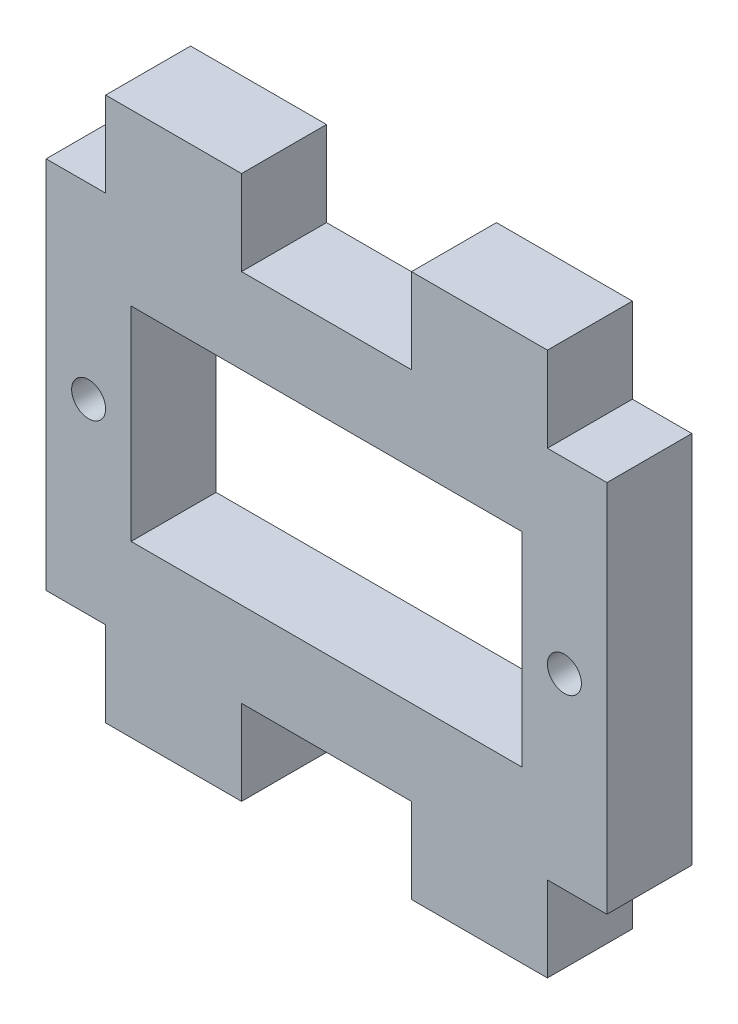
ISO-10303-21;
HEADER;
FILE_DESCRIPTION(('STEP AP214'),'2;1');
FILE_NAME('part.step','',(''),(''),'','','');
FILE_SCHEMA(('AUTOMOTIVE_DESIGN { 1 0 10303 214 1 1 1 1 }'));
ENDSEC;
DATA;
#1=APPLICATION_CONTEXT('core data for automotive mechanical design processes');
#2=APPLICATION_PROTOCOL_DEFINITION('international standard','automotive_design',2000,#1);
#3=PRODUCT_CONTEXT('',#1,'mechanical');
#4=PRODUCT('Part','Part','',(#3));
#5=PRODUCT_RELATED_PRODUCT_CATEGORY('part','',(#4));
#6=PRODUCT_DEFINITION_FORMATION('','',#4);
#7=PRODUCT_DEFINITION_CONTEXT('part definition',#1,'design');
#8=PRODUCT_DEFINITION('design','',#6,#7);
#9=PRODUCT_DEFINITION_SHAPE('','',#8);
#10=(LENGTH_UNIT() NAMED_UNIT(*) SI_UNIT(.MILLI.,.METRE.));
#11=(NAMED_UNIT(*) PLANE_ANGLE_UNIT() SI_UNIT($,.RADIAN.));
#12=(NAMED_UNIT(*) SI_UNIT($,.STERADIAN.) SOLID_ANGLE_UNIT());
#13=UNCERTAINTY_MEASURE_WITH_UNIT(LENGTH_MEASURE(1.E-05),#10,'distance_accuracy_value','');
#14=(GEOMETRIC_REPRESENTATION_CONTEXT(3) GLOBAL_UNCERTAINTY_ASSIGNED_CONTEXT((#13)) GLOBAL_UNIT_ASSIGNED_CONTEXT((#10,
#11,#12)) REPRESENTATION_CONTEXT('',''));
#15=CARTESIAN_POINT('',(0.,0.,0.));
#16=DIRECTION('',(0.,0.,1.));
#17=DIRECTION('',(1.,0.,0.));
#18=AXIS2_PLACEMENT_3D('',#15,#16,#17);
#19=CARTESIAN_POINT('',(0.,0.,5.));
#20=DIRECTION('',(0.,0.,-1.));
#21=DIRECTION('',(-1.,0.,0.));
#22=AXIS2_PLACEMENT_3D('',#19,#20,#21);
#23=PLANE('',#22);
#24=CARTESIAN_POINT('',(14.,0.,5.));
#25=DIRECTION('',(0.,0.,1.));
#26=DIRECTION('',(1.,0.,0.));
#27=AXIS2_PLACEMENT_3D('',#24,#25,#26);
#28=CIRCLE('',#27,1.);
#29=CARTESIAN_POINT('',(15.,0.,5.));
#30=VERTEX_POINT('',#29);
#31=EDGE_CURVE('E229',#30,#30,#28,.T.);
#32=ORIENTED_EDGE('',*,*,#31,.F.);
#33=EDGE_LOOP('',(#32));
#34=FACE_BOUND('',#33,.T.);
#35=CARTESIAN_POINT('',(-14.,0.,5.));
#36=DIRECTION('',(0.,0.,1.));
#37=DIRECTION('',(1.,0.,0.));
#38=AXIS2_PLACEMENT_3D('',#35,#36,#37);
#39=CIRCLE('',#38,1.);
#40=CARTESIAN_POINT('',(-13.,0.,5.));
#41=VERTEX_POINT('',#40);
#42=EDGE_CURVE('E235',#41,#41,#39,.T.);
#43=ORIENTED_EDGE('',*,*,#42,.F.);
#44=EDGE_LOOP('',(#43));
#45=FACE_BOUND('',#44,.T.);
#46=DIRECTION('',(-1.,0.,0.));
#47=VECTOR('',#46,1.);
#48=CARTESIAN_POINT('',(5.,11.,5.));
#49=LINE('',#48,#47);
#50=CARTESIAN_POINT('',(5.,11.,5.));
#51=VERTEX_POINT('',#50);
#52=CARTESIAN_POINT('',(-5.,11.,5.));
#53=VERTEX_POINT('',#52);
#54=EDGE_CURVE('E241',#51,#53,#49,.T.);
#55=ORIENTED_EDGE('',*,*,#54,.T.);
#56=DIRECTION('',(0.,1.,0.));
#57=VECTOR('',#56,1.);
#58=CARTESIAN_POINT('',(-5.,11.,5.));
#59=LINE('',#58,#57);
#60=CARTESIAN_POINT('',(-5.,16.,5.));
#61=VERTEX_POINT('',#60);
#62=EDGE_CURVE('E244',#53,#61,#59,.T.);
#63=ORIENTED_EDGE('',*,*,#62,.T.);
#64=DIRECTION('',(-1.,0.,0.));
#65=VECTOR('',#64,1.);
#66=CARTESIAN_POINT('',(-13.,16.,5.));
#67=LINE('',#66,#65);
#68=CARTESIAN_POINT('',(-13.,16.,5.));
#69=VERTEX_POINT('',#68);
#70=EDGE_CURVE('E247',#61,#69,#67,.T.);
#71=ORIENTED_EDGE('',*,*,#70,.T.);
#72=DIRECTION('',(0.,-1.,0.));
#73=VECTOR('',#72,1.);
#74=CARTESIAN_POINT('',(-13.,16.,5.));
#75=LINE('',#74,#73);
#76=CARTESIAN_POINT('',(-13.,11.,5.));
#77=VERTEX_POINT('',#76);
#78=EDGE_CURVE('E249',#69,#77,#75,.T.);
#79=ORIENTED_EDGE('',*,*,#78,.T.);
#80=DIRECTION('',(-1.,0.,0.));
#81=VECTOR('',#80,1.);
#82=CARTESIAN_POINT('',(-13.,11.,5.));
#83=LINE('',#82,#81);
#84=CARTESIAN_POINT('',(-16.5,11.,5.));
#85=VERTEX_POINT('',#84);
#86=EDGE_CURVE('E251',#77,#85,#83,.T.);
#87=ORIENTED_EDGE('',*,*,#86,.T.);
#88=DIRECTION('',(0.,-1.,0.));
#89=VECTOR('',#88,1.);
#90=CARTESIAN_POINT('',(-16.5,11.,5.));
#91=LINE('',#90,#89);
#92=CARTESIAN_POINT('',(-16.5,-11.,5.));
#93=VERTEX_POINT('',#92);
#94=EDGE_CURVE('E253',#85,#93,#91,.T.);
#95=ORIENTED_EDGE('',*,*,#94,.T.);
#96=DIRECTION('',(1.,0.,0.));
#97=VECTOR('',#96,1.);
#98=CARTESIAN_POINT('',(-16.5,-11.,5.));
#99=LINE('',#98,#97);
#100=CARTESIAN_POINT('',(-13.,-11.,5.));
#101=VERTEX_POINT('',#100);
#102=EDGE_CURVE('E255',#93,#101,#99,.T.);
#103=ORIENTED_EDGE('',*,*,#102,.T.);
#104=DIRECTION('',(0.,-1.,0.));
#105=VECTOR('',#104,1.);
#106=CARTESIAN_POINT('',(-13.,-16.,5.));
#107=LINE('',#106,#105);
#108=CARTESIAN_POINT('',(-13.,-16.,5.));
#109=VERTEX_POINT('',#108);
#110=EDGE_CURVE('E257',#101,#109,#107,.T.);
#111=ORIENTED_EDGE('',*,*,#110,.T.);
#112=DIRECTION('',(1.,0.,0.));
#113=VECTOR('',#112,1.);
#114=CARTESIAN_POINT('',(-13.,-16.,5.));
#115=LINE('',#114,#113);
#116=CARTESIAN_POINT('',(-5.,-16.,5.));
#117=VERTEX_POINT('',#116);
#118=EDGE_CURVE('E259',#109,#117,#115,.T.);
#119=ORIENTED_EDGE('',*,*,#118,.T.);
#120=DIRECTION('',(0.,1.,0.));
#121=VECTOR('',#120,1.);
#122=CARTESIAN_POINT('',(-5.,-11.,5.));
#123=LINE('',#122,#121);
#124=CARTESIAN_POINT('',(-5.,-11.,5.));
#125=VERTEX_POINT('',#124);
#126=EDGE_CURVE('E261',#117,#125,#123,.T.);
#127=ORIENTED_EDGE('',*,*,#126,.T.);
#128=DIRECTION('',(1.,0.,0.));
#129=VECTOR('',#128,1.);
#130=CARTESIAN_POINT('',(5.,-11.,5.));
#131=LINE('',#130,#129);
#132=CARTESIAN_POINT('',(5.,-11.,5.));
#133=VERTEX_POINT('',#132);
#134=EDGE_CURVE('E263',#125,#133,#131,.T.);
#135=ORIENTED_EDGE('',*,*,#134,.T.);
#136=DIRECTION('',(0.,-1.,0.));
#137=VECTOR('',#136,1.);
#138=CARTESIAN_POINT('',(5.,-11.,5.));
#139=LINE('',#138,#137);
#140=CARTESIAN_POINT('',(5.,-16.,5.));
#141=VERTEX_POINT('',#140);
#142=EDGE_CURVE('E265',#133,#141,#139,.T.);
#143=ORIENTED_EDGE('',*,*,#142,.T.);
#144=DIRECTION('',(1.,0.,0.));
#145=VECTOR('',#144,1.);
#146=CARTESIAN_POINT('',(5.,-16.,5.));
#147=LINE('',#146,#145);
#148=CARTESIAN_POINT('',(13.,-16.,5.));
#149=VERTEX_POINT('',#148);
#150=EDGE_CURVE('E267',#141,#149,#147,.T.);
#151=ORIENTED_EDGE('',*,*,#150,.T.);
#152=DIRECTION('',(0.,1.,0.));
#153=VECTOR('',#152,1.);
#154=CARTESIAN_POINT('',(13.,-16.,5.));
#155=LINE('',#154,#153);
#156=CARTESIAN_POINT('',(13.,-11.,5.));
#157=VERTEX_POINT('',#156);
#158=EDGE_CURVE('E269',#149,#157,#155,.T.);
#159=ORIENTED_EDGE('',*,*,#158,.T.);
#160=DIRECTION('',(1.,0.,0.));
#161=VECTOR('',#160,1.);
#162=CARTESIAN_POINT('',(13.,-11.,5.));
#163=LINE('',#162,#161);
#164=CARTESIAN_POINT('',(16.5,-11.,5.));
#165=VERTEX_POINT('',#164);
#166=EDGE_CURVE('E271',#157,#165,#163,.T.);
#167=ORIENTED_EDGE('',*,*,#166,.T.);
#168=DIRECTION('',(0.,1.,0.));
#169=VECTOR('',#168,1.);
#170=CARTESIAN_POINT('',(16.5,-11.,5.));
#171=LINE('',#170,#169);
#172=CARTESIAN_POINT('',(16.5,11.,5.));
#173=VERTEX_POINT('',#172);
#174=EDGE_CURVE('E273',#165,#173,#171,.T.);
#175=ORIENTED_EDGE('',*,*,#174,.T.);
#176=DIRECTION('',(-1.,0.,0.));
#177=VECTOR('',#176,1.);
#178=CARTESIAN_POINT('',(16.5,11.,5.));
#179=LINE('',#178,#177);
#180=CARTESIAN_POINT('',(13.,11.,5.));
#181=VERTEX_POINT('',#180);
#182=EDGE_CURVE('E275',#173,#181,#179,.T.);
#183=ORIENTED_EDGE('',*,*,#182,.T.);
#184=DIRECTION('',(0.,1.,0.));
#185=VECTOR('',#184,1.);
#186=CARTESIAN_POINT('',(13.,16.,5.));
#187=LINE('',#186,#185);
#188=CARTESIAN_POINT('',(13.,16.,5.));
#189=VERTEX_POINT('',#188);
#190=EDGE_CURVE('E277',#181,#189,#187,.T.);
#191=ORIENTED_EDGE('',*,*,#190,.T.);
#192=DIRECTION('',(-1.,0.,0.));
#193=VECTOR('',#192,1.);
#194=CARTESIAN_POINT('',(5.,16.,5.));
#195=LINE('',#194,#193);
#196=CARTESIAN_POINT('',(5.,16.,5.));
#197=VERTEX_POINT('',#196);
#198=EDGE_CURVE('E279',#189,#197,#195,.T.);
#199=ORIENTED_EDGE('',*,*,#198,.T.);
#200=DIRECTION('',(0.,-1.,0.));
#201=VECTOR('',#200,1.);
#202=CARTESIAN_POINT('',(5.,11.,5.));
#203=LINE('',#202,#201);
#204=EDGE_CURVE('E281',#197,#51,#203,.T.);
#205=ORIENTED_EDGE('',*,*,#204,.T.);
#206=EDGE_LOOP('',(#55,#63,#71,#79,#87,#95,#103,#111,#119,#127,#135,#143,#151,#159,#167,#175,
#183,#191,#199,#205));
#207=FACE_BOUND('',#206,.T.);
#208=DIRECTION('',(-1.,0.,0.));
#209=VECTOR('',#208,1.);
#210=CARTESIAN_POINT('',(11.5,6.00000005215406,5.));
#211=LINE('',#210,#209);
#212=CARTESIAN_POINT('',(11.5,6.00000005215406,5.));
#213=VERTEX_POINT('',#212);
#214=CARTESIAN_POINT('',(-11.5,6.00000005215406,5.));
#215=VERTEX_POINT('',#214);
#216=EDGE_CURVE('E193',#213,#215,#211,.T.);
#217=ORIENTED_EDGE('',*,*,#216,.F.);
#218=DIRECTION('',(0.,1.,0.));
#219=VECTOR('',#218,1.);
#220=CARTESIAN_POINT('',(11.5,-6.00000005215406,5.));
#221=LINE('',#220,#219);
#222=CARTESIAN_POINT('',(11.5,-6.00000005215406,5.));
#223=VERTEX_POINT('',#222);
#224=EDGE_CURVE('E215',#223,#213,#221,.T.);
#225=ORIENTED_EDGE('',*,*,#224,.F.);
#226=DIRECTION('',(1.,0.,0.));
#227=VECTOR('',#226,1.);
#228=CARTESIAN_POINT('',(-11.5,-6.00000005215406,5.));
#229=LINE('',#228,#227);
#230=CARTESIAN_POINT('',(-11.5,-6.00000005215406,5.));
#231=VERTEX_POINT('',#230);
#232=EDGE_CURVE('E213',#231,#223,#229,.T.);
#233=ORIENTED_EDGE('',*,*,#232,.F.);
#234=DIRECTION('',(0.,-1.,0.));
#235=VECTOR('',#234,1.);
#236=CARTESIAN_POINT('',(-11.5,6.00000005215406,5.));
#237=LINE('',#236,#235);
#238=EDGE_CURVE('E201',#215,#231,#237,.T.);
#239=ORIENTED_EDGE('',*,*,#238,.F.);
#240=EDGE_LOOP('',(#217,#225,#233,#239));
#241=FACE_BOUND('',#240,.T.);
#242=ADVANCED_FACE('F32',(#34,#45,#207,#241),#23,.F.);
#243=CARTESIAN_POINT('',(0.,0.,0.));
#244=DIRECTION('',(0.,0.,-1.));
#245=DIRECTION('',(-1.,0.,0.));
#246=AXIS2_PLACEMENT_3D('',#243,#244,#245);
#247=PLANE('',#246);
#248=CARTESIAN_POINT('',(-14.,0.,0.));
#249=DIRECTION('',(0.,0.,1.));
#250=DIRECTION('',(1.,0.,0.));
#251=AXIS2_PLACEMENT_3D('',#248,#249,#250);
#252=CIRCLE('',#251,1.);
#253=CARTESIAN_POINT('',(-13.,0.,0.));
#254=VERTEX_POINT('',#253);
#255=EDGE_CURVE('E232',#254,#254,#252,.T.);
#256=ORIENTED_EDGE('',*,*,#255,.T.);
#257=EDGE_LOOP('',(#256));
#258=FACE_BOUND('',#257,.T.);
#259=DIRECTION('',(-1.,0.,0.));
#260=VECTOR('',#259,1.);
#261=CARTESIAN_POINT('',(5.,11.,0.));
#262=LINE('',#261,#260);
#263=CARTESIAN_POINT('',(5.,11.,0.));
#264=VERTEX_POINT('',#263);
#265=CARTESIAN_POINT('',(-5.,11.,0.));
#266=VERTEX_POINT('',#265);
#267=EDGE_CURVE('E238',#264,#266,#262,.T.);
#268=ORIENTED_EDGE('',*,*,#267,.F.);
#269=DIRECTION('',(0.,-1.,0.));
#270=VECTOR('',#269,1.);
#271=CARTESIAN_POINT('',(5.,11.,0.));
#272=LINE('',#271,#270);
#273=CARTESIAN_POINT('',(5.,16.,0.));
#274=VERTEX_POINT('',#273);
#275=EDGE_CURVE('E245',#274,#264,#272,.T.);
#276=ORIENTED_EDGE('',*,*,#275,.F.);
#277=DIRECTION('',(-1.,0.,0.));
#278=VECTOR('',#277,1.);
#279=CARTESIAN_POINT('',(5.,16.,0.));
#280=LINE('',#279,#278);
#281=CARTESIAN_POINT('',(13.,16.,0.));
#282=VERTEX_POINT('',#281);
#283=EDGE_CURVE('E320',#282,#274,#280,.T.);
#284=ORIENTED_EDGE('',*,*,#283,.F.);
#285=DIRECTION('',(0.,1.,0.));
#286=VECTOR('',#285,1.);
#287=CARTESIAN_POINT('',(13.,16.,0.));
#288=LINE('',#287,#286);
#289=CARTESIAN_POINT('',(13.,11.,0.));
#290=VERTEX_POINT('',#289);
#291=EDGE_CURVE('E318',#290,#282,#288,.T.);
#292=ORIENTED_EDGE('',*,*,#291,.F.);
#293=DIRECTION('',(-1.,0.,0.));
#294=VECTOR('',#293,1.);
#295=CARTESIAN_POINT('',(16.5,11.,0.));
#296=LINE('',#295,#294);
#297=CARTESIAN_POINT('',(16.5,11.,0.));
#298=VERTEX_POINT('',#297);
#299=EDGE_CURVE('E316',#298,#290,#296,.T.);
#300=ORIENTED_EDGE('',*,*,#299,.F.);
#301=DIRECTION('',(0.,1.,0.));
#302=VECTOR('',#301,1.);
#303=CARTESIAN_POINT('',(16.5,-11.,0.));
#304=LINE('',#303,#302);
#305=CARTESIAN_POINT('',(16.5,-11.,0.));
#306=VERTEX_POINT('',#305);
#307=EDGE_CURVE('E314',#306,#298,#304,.T.);
#308=ORIENTED_EDGE('',*,*,#307,.F.);
#309=DIRECTION('',(1.,0.,0.));
#310=VECTOR('',#309,1.);
#311=CARTESIAN_POINT('',(13.,-11.,0.));
#312=LINE('',#311,#310);
#313=CARTESIAN_POINT('',(13.,-11.,0.));
#314=VERTEX_POINT('',#313);
#315=EDGE_CURVE('E312',#314,#306,#312,.T.);
#316=ORIENTED_EDGE('',*,*,#315,.F.);
#317=DIRECTION('',(0.,1.,0.));
#318=VECTOR('',#317,1.);
#319=CARTESIAN_POINT('',(13.,-16.,0.));
#320=LINE('',#319,#318);
#321=CARTESIAN_POINT('',(13.,-16.,0.));
#322=VERTEX_POINT('',#321);
#323=EDGE_CURVE('E310',#322,#314,#320,.T.);
#324=ORIENTED_EDGE('',*,*,#323,.F.);
#325=DIRECTION('',(1.,0.,0.));
#326=VECTOR('',#325,1.);
#327=CARTESIAN_POINT('',(5.,-16.,0.));
#328=LINE('',#327,#326);
#329=CARTESIAN_POINT('',(5.,-16.,0.));
#330=VERTEX_POINT('',#329);
#331=EDGE_CURVE('E308',#330,#322,#328,.T.);
#332=ORIENTED_EDGE('',*,*,#331,.F.);
#333=DIRECTION('',(0.,-1.,0.));
#334=VECTOR('',#333,1.);
#335=CARTESIAN_POINT('',(5.,-11.,0.));
#336=LINE('',#335,#334);
#337=CARTESIAN_POINT('',(5.,-11.,0.));
#338=VERTEX_POINT('',#337);
#339=EDGE_CURVE('E306',#338,#330,#336,.T.);
#340=ORIENTED_EDGE('',*,*,#339,.F.);
#341=DIRECTION('',(1.,0.,0.));
#342=VECTOR('',#341,1.);
#343=CARTESIAN_POINT('',(5.,-11.,0.));
#344=LINE('',#343,#342);
#345=CARTESIAN_POINT('',(-5.,-11.,0.));
#346=VERTEX_POINT('',#345);
#347=EDGE_CURVE('E304',#346,#338,#344,.T.);
#348=ORIENTED_EDGE('',*,*,#347,.F.);
#349=DIRECTION('',(0.,1.,0.));
#350=VECTOR('',#349,1.);
#351=CARTESIAN_POINT('',(-5.,-11.,0.));
#352=LINE('',#351,#350);
#353=CARTESIAN_POINT('',(-5.,-16.,0.));
#354=VERTEX_POINT('',#353);
#355=EDGE_CURVE('E302',#354,#346,#352,.T.);
#356=ORIENTED_EDGE('',*,*,#355,.F.);
#357=DIRECTION('',(1.,0.,0.));
#358=VECTOR('',#357,1.);
#359=CARTESIAN_POINT('',(-13.,-16.,0.));
#360=LINE('',#359,#358);
#361=CARTESIAN_POINT('',(-13.,-16.,0.));
#362=VERTEX_POINT('',#361);
#363=EDGE_CURVE('E300',#362,#354,#360,.T.);
#364=ORIENTED_EDGE('',*,*,#363,.F.);
#365=DIRECTION('',(0.,-1.,0.));
#366=VECTOR('',#365,1.);
#367=CARTESIAN_POINT('',(-13.,-16.,0.));
#368=LINE('',#367,#366);
#369=CARTESIAN_POINT('',(-13.,-11.,0.));
#370=VERTEX_POINT('',#369);
#371=EDGE_CURVE('E298',#370,#362,#368,.T.);
#372=ORIENTED_EDGE('',*,*,#371,.F.);
#373=DIRECTION('',(1.,0.,0.));
#374=VECTOR('',#373,1.);
#375=CARTESIAN_POINT('',(-16.5,-11.,0.));
#376=LINE('',#375,#374);
#377=CARTESIAN_POINT('',(-16.5,-11.,0.));
#378=VERTEX_POINT('',#377);
#379=EDGE_CURVE('E296',#378,#370,#376,.T.);
#380=ORIENTED_EDGE('',*,*,#379,.F.);
#381=DIRECTION('',(0.,-1.,0.));
#382=VECTOR('',#381,1.);
#383=CARTESIAN_POINT('',(-16.5,11.,0.));
#384=LINE('',#383,#382);
#385=CARTESIAN_POINT('',(-16.5,11.,0.));
#386=VERTEX_POINT('',#385);
#387=EDGE_CURVE('E294',#386,#378,#384,.T.);
#388=ORIENTED_EDGE('',*,*,#387,.F.);
#389=DIRECTION('',(-1.,0.,0.));
#390=VECTOR('',#389,1.);
#391=CARTESIAN_POINT('',(-13.,11.,0.));
#392=LINE('',#391,#390);
#393=CARTESIAN_POINT('',(-13.,11.,0.));
#394=VERTEX_POINT('',#393);
#395=EDGE_CURVE('E292',#394,#386,#392,.T.);
#396=ORIENTED_EDGE('',*,*,#395,.F.);
#397=DIRECTION('',(0.,-1.,0.));
#398=VECTOR('',#397,1.);
#399=CARTESIAN_POINT('',(-13.,16.,0.));
#400=LINE('',#399,#398);
#401=CARTESIAN_POINT('',(-13.,16.,0.));
#402=VERTEX_POINT('',#401);
#403=EDGE_CURVE('E290',#402,#394,#400,.T.);
#404=ORIENTED_EDGE('',*,*,#403,.F.);
#405=DIRECTION('',(-1.,0.,0.));
#406=VECTOR('',#405,1.);
#407=CARTESIAN_POINT('',(-13.,16.,0.));
#408=LINE('',#407,#406);
#409=CARTESIAN_POINT('',(-5.,16.,0.));
#410=VERTEX_POINT('',#409);
#411=EDGE_CURVE('E288',#410,#402,#408,.T.);
#412=ORIENTED_EDGE('',*,*,#411,.F.);
#413=DIRECTION('',(0.,1.,0.));
#414=VECTOR('',#413,1.);
#415=CARTESIAN_POINT('',(-5.,11.,0.));
#416=LINE('',#415,#414);
#417=EDGE_CURVE('E286',#266,#410,#416,.T.);
#418=ORIENTED_EDGE('',*,*,#417,.F.);
#419=EDGE_LOOP('',(#268,#276,#284,#292,#300,#308,#316,#324,#332,#340,#348,#356,#364,#372,#380,
#388,#396,#404,#412,#418));
#420=FACE_BOUND('',#419,.T.);
#421=CARTESIAN_POINT('',(14.,0.,0.));
#422=DIRECTION('',(0.,0.,1.));
#423=DIRECTION('',(1.,0.,0.));
#424=AXIS2_PLACEMENT_3D('',#421,#422,#423);
#425=CIRCLE('',#424,1.);
#426=CARTESIAN_POINT('',(15.,0.,0.));
#427=VERTEX_POINT('',#426);
#428=EDGE_CURVE('E209',#427,#427,#425,.T.);
#429=ORIENTED_EDGE('',*,*,#428,.T.);
#430=EDGE_LOOP('',(#429));
#431=FACE_BOUND('',#430,.T.);
#432=DIRECTION('',(0.,1.,0.));
#433=VECTOR('',#432,1.);
#434=CARTESIAN_POINT('',(11.5,-6.00000005215406,0.));
#435=LINE('',#434,#433);
#436=CARTESIAN_POINT('',(11.5,-6.00000005215406,0.));
#437=VERTEX_POINT('',#436);
#438=CARTESIAN_POINT('',(11.5,6.00000005215406,0.));
#439=VERTEX_POINT('',#438);
#440=EDGE_CURVE('E202',#437,#439,#435,.T.);
#441=ORIENTED_EDGE('',*,*,#440,.T.);
#442=DIRECTION('',(-1.,0.,0.));
#443=VECTOR('',#442,1.);
#444=CARTESIAN_POINT('',(11.5,6.00000005215406,0.));
#445=LINE('',#444,#443);
#446=CARTESIAN_POINT('',(-11.5,6.00000005215406,0.));
#447=VERTEX_POINT('',#446);
#448=EDGE_CURVE('E55',#439,#447,#445,.T.);
#449=ORIENTED_EDGE('',*,*,#448,.T.);
#450=DIRECTION('',(0.,-1.,0.));
#451=VECTOR('',#450,1.);
#452=CARTESIAN_POINT('',(-11.5,6.00000005215406,0.));
#453=LINE('',#452,#451);
#454=CARTESIAN_POINT('',(-11.5,-6.00000005215406,0.));
#455=VERTEX_POINT('',#454);
#456=EDGE_CURVE('E208',#447,#455,#453,.T.);
#457=ORIENTED_EDGE('',*,*,#456,.T.);
#458=DIRECTION('',(1.,0.,0.));
#459=VECTOR('',#458,1.);
#460=CARTESIAN_POINT('',(-11.5,-6.00000005215406,0.));
#461=LINE('',#460,#459);
#462=EDGE_CURVE('E221',#455,#437,#461,.T.);
#463=ORIENTED_EDGE('',*,*,#462,.T.);
#464=EDGE_LOOP('',(#441,#449,#457,#463));
#465=FACE_BOUND('',#464,.T.);
#466=ADVANCED_FACE('F386',(#258,#420,#431,#465),#247,.T.);
#467=CARTESIAN_POINT('',(5.,11.,5.));
#468=DIRECTION('',(0.,-1.,0.));
#469=DIRECTION('',(1.,0.,0.));
#470=AXIS2_PLACEMENT_3D('',#467,#468,#469);
#471=PLANE('',#470);
#472=ORIENTED_EDGE('',*,*,#267,.T.);
#473=DIRECTION('',(0.,0.,-1.));
#474=VECTOR('',#473,1.);
#475=CARTESIAN_POINT('',(-5.,11.,5.));
#476=LINE('',#475,#474);
#477=EDGE_CURVE('E11',#53,#266,#476,.T.);
#478=ORIENTED_EDGE('',*,*,#477,.F.);
#479=ORIENTED_EDGE('',*,*,#54,.F.);
#480=DIRECTION('',(0.,0.,-1.));
#481=VECTOR('',#480,1.);
#482=CARTESIAN_POINT('',(5.,11.,5.));
#483=LINE('',#482,#481);
#484=EDGE_CURVE('E283',#51,#264,#483,.T.);
#485=ORIENTED_EDGE('',*,*,#484,.T.);
#486=EDGE_LOOP('',(#472,#478,#479,#485));
#487=FACE_BOUND('',#486,.T.);
#488=ADVANCED_FACE('F34',(#487),#471,.F.);
#489=CARTESIAN_POINT('',(-5.,11.,5.));
#490=DIRECTION('',(-1.,0.,0.));
#491=DIRECTION('',(0.,0.,1.));
#492=AXIS2_PLACEMENT_3D('',#489,#490,#491);
#493=PLANE('',#492);
#494=ORIENTED_EDGE('',*,*,#417,.T.);
#495=DIRECTION('',(0.,0.,-1.));
#496=VECTOR('',#495,1.);
#497=CARTESIAN_POINT('',(-5.,16.,5.));
#498=LINE('',#497,#496);
#499=EDGE_CURVE('E40',#61,#410,#498,.T.);
#500=ORIENTED_EDGE('',*,*,#499,.F.);
#501=ORIENTED_EDGE('',*,*,#62,.F.);
#502=ORIENTED_EDGE('',*,*,#477,.T.);
#503=EDGE_LOOP('',(#494,#500,#501,#502));
#504=FACE_BOUND('',#503,.T.);
#505=ADVANCED_FACE('F403',(#504),#493,.F.);
#506=CARTESIAN_POINT('',(-13.,16.,5.));
#507=DIRECTION('',(0.,-1.,0.));
#508=DIRECTION('',(0.,0.,-1.));
#509=AXIS2_PLACEMENT_3D('',#506,#507,#508);
#510=PLANE('',#509);
#511=ORIENTED_EDGE('',*,*,#411,.T.);
#512=DIRECTION('',(0.,0.,-1.));
#513=VECTOR('',#512,1.);
#514=CARTESIAN_POINT('',(-13.,16.,5.));
#515=LINE('',#514,#513);
#516=EDGE_CURVE('E373',#69,#402,#515,.T.);
#517=ORIENTED_EDGE('',*,*,#516,.F.);
#518=ORIENTED_EDGE('',*,*,#70,.F.);
#519=ORIENTED_EDGE('',*,*,#499,.T.);
#520=EDGE_LOOP('',(#511,#517,#518,#519));
#521=FACE_BOUND('',#520,.T.);
#522=ADVANCED_FACE('F380',(#521),#510,.F.);
#523=CARTESIAN_POINT('',(-13.,16.,5.));
#524=DIRECTION('',(1.,0.,0.));
#525=DIRECTION('',(0.,0.,-1.));
#526=AXIS2_PLACEMENT_3D('',#523,#524,#525);
#527=PLANE('',#526);
#528=ORIENTED_EDGE('',*,*,#403,.T.);
#529=DIRECTION('',(0.,0.,-1.));
#530=VECTOR('',#529,1.);
#531=CARTESIAN_POINT('',(-13.,11.,5.));
#532=LINE('',#531,#530);
#533=EDGE_CURVE('E370',#77,#394,#532,.T.);
#534=ORIENTED_EDGE('',*,*,#533,.F.);
#535=ORIENTED_EDGE('',*,*,#78,.F.);
#536=ORIENTED_EDGE('',*,*,#516,.T.);
#537=EDGE_LOOP('',(#528,#534,#535,#536));
#538=FACE_BOUND('',#537,.T.);
#539=ADVANCED_FACE('F392',(#538),#527,.F.);
#540=CARTESIAN_POINT('',(-13.,11.,5.));
#541=DIRECTION('',(0.,-1.,0.));
#542=DIRECTION('',(0.,0.,-1.));
#543=AXIS2_PLACEMENT_3D('',#540,#541,#542);
#544=PLANE('',#543);
#545=ORIENTED_EDGE('',*,*,#395,.T.);
#546=DIRECTION('',(0.,0.,-1.));
#547=VECTOR('',#546,1.);
#548=CARTESIAN_POINT('',(-16.5,11.,5.));
#549=LINE('',#548,#547);
#550=EDGE_CURVE('E367',#85,#386,#549,.T.);
#551=ORIENTED_EDGE('',*,*,#550,.F.);
#552=ORIENTED_EDGE('',*,*,#86,.F.);
#553=ORIENTED_EDGE('',*,*,#533,.T.);
#554=EDGE_LOOP('',(#545,#551,#552,#553));
#555=FACE_BOUND('',#554,.T.);
#556=ADVANCED_FACE('F396',(#555),#544,.F.);
#557=CARTESIAN_POINT('',(-16.5,11.,5.));
#558=DIRECTION('',(1.,0.,0.));
#559=DIRECTION('',(0.,1.,0.));
#560=AXIS2_PLACEMENT_3D('',#557,#558,#559);
#561=PLANE('',#560);
#562=ORIENTED_EDGE('',*,*,#387,.T.);
#563=DIRECTION('',(0.,0.,-1.));
#564=VECTOR('',#563,1.);
#565=CARTESIAN_POINT('',(-16.5,-11.,5.));
#566=LINE('',#565,#564);
#567=EDGE_CURVE('E364',#93,#378,#566,.T.);
#568=ORIENTED_EDGE('',*,*,#567,.F.);
#569=ORIENTED_EDGE('',*,*,#94,.F.);
#570=ORIENTED_EDGE('',*,*,#550,.T.);
#571=EDGE_LOOP('',(#562,#568,#569,#570));
#572=FACE_BOUND('',#571,.T.);
#573=ADVANCED_FACE('F476',(#572),#561,.F.);
#574=CARTESIAN_POINT('',(-16.5,-11.,5.));
#575=DIRECTION('',(0.,1.,0.));
#576=DIRECTION('',(0.,0.,1.));
#577=AXIS2_PLACEMENT_3D('',#574,#575,#576);
#578=PLANE('',#577);
#579=ORIENTED_EDGE('',*,*,#379,.T.);
#580=DIRECTION('',(0.,0.,-1.));
#581=VECTOR('',#580,1.);
#582=CARTESIAN_POINT('',(-13.,-11.,5.));
#583=LINE('',#582,#581);
#584=EDGE_CURVE('E361',#101,#370,#583,.T.);
#585=ORIENTED_EDGE('',*,*,#584,.F.);
#586=ORIENTED_EDGE('',*,*,#102,.F.);
#587=ORIENTED_EDGE('',*,*,#567,.T.);
#588=EDGE_LOOP('',(#579,#585,#586,#587));
#589=FACE_BOUND('',#588,.T.);
#590=ADVANCED_FACE('F474',(#589),#578,.F.);
#591=CARTESIAN_POINT('',(-13.,-16.,5.));
#592=DIRECTION('',(1.,0.,0.));
#593=DIRECTION('',(0.,0.,-1.));
#594=AXIS2_PLACEMENT_3D('',#591,#592,#593);
#595=PLANE('',#594);
#596=ORIENTED_EDGE('',*,*,#371,.T.);
#597=DIRECTION('',(0.,0.,-1.));
#598=VECTOR('',#597,1.);
#599=CARTESIAN_POINT('',(-13.,-16.,5.));
#600=LINE('',#599,#598);
#601=EDGE_CURVE('E358',#109,#362,#600,.T.);
#602=ORIENTED_EDGE('',*,*,#601,.F.);
#603=ORIENTED_EDGE('',*,*,#110,.F.);
#604=ORIENTED_EDGE('',*,*,#584,.T.);
#605=EDGE_LOOP('',(#596,#602,#603,#604));
#606=FACE_BOUND('',#605,.T.);
#607=ADVANCED_FACE('F469',(#606),#595,.F.);
#608=CARTESIAN_POINT('',(-13.,-16.,5.));
#609=DIRECTION('',(0.,1.,0.));
#610=DIRECTION('',(0.,0.,1.));
#611=AXIS2_PLACEMENT_3D('',#608,#609,#610);
#612=PLANE('',#611);
#613=ORIENTED_EDGE('',*,*,#363,.T.);
#614=DIRECTION('',(0.,0.,-1.));
#615=VECTOR('',#614,1.);
#616=CARTESIAN_POINT('',(-5.,-16.,5.));
#617=LINE('',#616,#615);
#618=EDGE_CURVE('E355',#117,#354,#617,.T.);
#619=ORIENTED_EDGE('',*,*,#618,.F.);
#620=ORIENTED_EDGE('',*,*,#118,.F.);
#621=ORIENTED_EDGE('',*,*,#601,.T.);
#622=EDGE_LOOP('',(#613,#619,#620,#621));
#623=FACE_BOUND('',#622,.T.);
#624=ADVANCED_FACE('F464',(#623),#612,.F.);
#625=CARTESIAN_POINT('',(-5.,-11.,5.));
#626=DIRECTION('',(-1.,0.,0.));
#627=DIRECTION('',(0.,0.,1.));
#628=AXIS2_PLACEMENT_3D('',#625,#626,#627);
#629=PLANE('',#628);
#630=ORIENTED_EDGE('',*,*,#355,.T.);
#631=DIRECTION('',(0.,0.,-1.));
#632=VECTOR('',#631,1.);
#633=CARTESIAN_POINT('',(-5.,-11.,5.));
#634=LINE('',#633,#632);
#635=EDGE_CURVE('E352',#125,#346,#634,.T.);
#636=ORIENTED_EDGE('',*,*,#635,.F.);
#637=ORIENTED_EDGE('',*,*,#126,.F.);
#638=ORIENTED_EDGE('',*,*,#618,.T.);
#639=EDGE_LOOP('',(#630,#636,#637,#638));
#640=FACE_BOUND('',#639,.T.);
#641=ADVANCED_FACE('F460',(#640),#629,.F.);
#642=CARTESIAN_POINT('',(5.,-11.,5.));
#643=DIRECTION('',(0.,1.,0.));
#644=DIRECTION('',(-1.,0.,0.));
#645=AXIS2_PLACEMENT_3D('',#642,#643,#644);
#646=PLANE('',#645);
#647=ORIENTED_EDGE('',*,*,#347,.T.);
#648=DIRECTION('',(0.,0.,-1.));
#649=VECTOR('',#648,1.);
#650=CARTESIAN_POINT('',(5.,-11.,5.));
#651=LINE('',#650,#649);
#652=EDGE_CURVE('E349',#133,#338,#651,.T.);
#653=ORIENTED_EDGE('',*,*,#652,.F.);
#654=ORIENTED_EDGE('',*,*,#134,.F.);
#655=ORIENTED_EDGE('',*,*,#635,.T.);
#656=EDGE_LOOP('',(#647,#653,#654,#655));
#657=FACE_BOUND('',#656,.T.);
#658=ADVANCED_FACE('F455',(#657),#646,.F.);
#659=CARTESIAN_POINT('',(5.,-11.,5.));
#660=DIRECTION('',(1.,0.,0.));
#661=DIRECTION('',(0.,1.,0.));
#662=AXIS2_PLACEMENT_3D('',#659,#660,#661);
#663=PLANE('',#662);
#664=ORIENTED_EDGE('',*,*,#339,.T.);
#665=DIRECTION('',(0.,0.,-1.));
#666=VECTOR('',#665,1.);
#667=CARTESIAN_POINT('',(5.,-16.,5.));
#668=LINE('',#667,#666);
#669=EDGE_CURVE('E346',#141,#330,#668,.T.);
#670=ORIENTED_EDGE('',*,*,#669,.F.);
#671=ORIENTED_EDGE('',*,*,#142,.F.);
#672=ORIENTED_EDGE('',*,*,#652,.T.);
#673=EDGE_LOOP('',(#664,#670,#671,#672));
#674=FACE_BOUND('',#673,.T.);
#675=ADVANCED_FACE('F449',(#674),#663,.F.);
#676=CARTESIAN_POINT('',(5.,-16.,5.));
#677=DIRECTION('',(0.,1.,0.));
#678=DIRECTION('',(0.,0.,1.));
#679=AXIS2_PLACEMENT_3D('',#676,#677,#678);
#680=PLANE('',#679);
#681=ORIENTED_EDGE('',*,*,#331,.T.);
#682=DIRECTION('',(0.,0.,-1.));
#683=VECTOR('',#682,1.);
#684=CARTESIAN_POINT('',(13.,-16.,5.));
#685=LINE('',#684,#683);
#686=EDGE_CURVE('E343',#149,#322,#685,.T.);
#687=ORIENTED_EDGE('',*,*,#686,.F.);
#688=ORIENTED_EDGE('',*,*,#150,.F.);
#689=ORIENTED_EDGE('',*,*,#669,.T.);
#690=EDGE_LOOP('',(#681,#687,#688,#689));
#691=FACE_BOUND('',#690,.T.);
#692=ADVANCED_FACE('F445',(#691),#680,.F.);
#693=CARTESIAN_POINT('',(13.,-16.,5.));
#694=DIRECTION('',(-1.,0.,0.));
#695=DIRECTION('',(0.,-1.,0.));
#696=AXIS2_PLACEMENT_3D('',#693,#694,#695);
#697=PLANE('',#696);
#698=ORIENTED_EDGE('',*,*,#323,.T.);
#699=DIRECTION('',(0.,0.,-1.));
#700=VECTOR('',#699,1.);
#701=CARTESIAN_POINT('',(13.,-11.,5.));
#702=LINE('',#701,#700);
#703=EDGE_CURVE('E340',#157,#314,#702,.T.);
#704=ORIENTED_EDGE('',*,*,#703,.F.);
#705=ORIENTED_EDGE('',*,*,#158,.F.);
#706=ORIENTED_EDGE('',*,*,#686,.T.);
#707=EDGE_LOOP('',(#698,#704,#705,#706));
#708=FACE_BOUND('',#707,.T.);
#709=ADVANCED_FACE('F440',(#708),#697,.F.);
#710=CARTESIAN_POINT('',(13.,-11.,5.));
#711=DIRECTION('',(0.,1.,0.));
#712=DIRECTION('',(0.,0.,1.));
#713=AXIS2_PLACEMENT_3D('',#710,#711,#712);
#714=PLANE('',#713);
#715=ORIENTED_EDGE('',*,*,#315,.T.);
#716=DIRECTION('',(0.,0.,-1.));
#717=VECTOR('',#716,1.);
#718=CARTESIAN_POINT('',(16.5,-11.,5.));
#719=LINE('',#718,#717);
#720=EDGE_CURVE('E337',#165,#306,#719,.T.);
#721=ORIENTED_EDGE('',*,*,#720,.F.);
#722=ORIENTED_EDGE('',*,*,#166,.F.);
#723=ORIENTED_EDGE('',*,*,#703,.T.);
#724=EDGE_LOOP('',(#715,#721,#722,#723));
#725=FACE_BOUND('',#724,.T.);
#726=ADVANCED_FACE('F434',(#725),#714,.F.);
#727=CARTESIAN_POINT('',(16.5,-11.,5.));
#728=DIRECTION('',(-1.,0.,0.));
#729=DIRECTION('',(0.,0.,1.));
#730=AXIS2_PLACEMENT_3D('',#727,#728,#729);
#731=PLANE('',#730);
#732=ORIENTED_EDGE('',*,*,#307,.T.);
#733=DIRECTION('',(0.,0.,-1.));
#734=VECTOR('',#733,1.);
#735=CARTESIAN_POINT('',(16.5,11.,5.));
#736=LINE('',#735,#734);
#737=EDGE_CURVE('E334',#173,#298,#736,.T.);
#738=ORIENTED_EDGE('',*,*,#737,.F.);
#739=ORIENTED_EDGE('',*,*,#174,.F.);
#740=ORIENTED_EDGE('',*,*,#720,.T.);
#741=EDGE_LOOP('',(#732,#738,#739,#740));
#742=FACE_BOUND('',#741,.T.);
#743=ADVANCED_FACE('F430',(#742),#731,.F.);
#744=CARTESIAN_POINT('',(16.5,11.,5.));
#745=DIRECTION('',(0.,-1.,0.));
#746=DIRECTION('',(1.,0.,0.));
#747=AXIS2_PLACEMENT_3D('',#744,#745,#746);
#748=PLANE('',#747);
#749=ORIENTED_EDGE('',*,*,#299,.T.);
#750=DIRECTION('',(0.,0.,-1.));
#751=VECTOR('',#750,1.);
#752=CARTESIAN_POINT('',(13.,11.,5.));
#753=LINE('',#752,#751);
#754=EDGE_CURVE('E331',#181,#290,#753,.T.);
#755=ORIENTED_EDGE('',*,*,#754,.F.);
#756=ORIENTED_EDGE('',*,*,#182,.F.);
#757=ORIENTED_EDGE('',*,*,#737,.T.);
#758=EDGE_LOOP('',(#749,#755,#756,#757));
#759=FACE_BOUND('',#758,.T.);
#760=ADVANCED_FACE('F425',(#759),#748,.F.);
#761=CARTESIAN_POINT('',(13.,16.,5.));
#762=DIRECTION('',(-1.,0.,0.));
#763=DIRECTION('',(0.,0.,1.));
#764=AXIS2_PLACEMENT_3D('',#761,#762,#763);
#765=PLANE('',#764);
#766=ORIENTED_EDGE('',*,*,#291,.T.);
#767=DIRECTION('',(0.,0.,-1.));
#768=VECTOR('',#767,1.);
#769=CARTESIAN_POINT('',(13.,16.,5.));
#770=LINE('',#769,#768);
#771=EDGE_CURVE('E328',#189,#282,#770,.T.);
#772=ORIENTED_EDGE('',*,*,#771,.F.);
#773=ORIENTED_EDGE('',*,*,#190,.F.);
#774=ORIENTED_EDGE('',*,*,#754,.T.);
#775=EDGE_LOOP('',(#766,#772,#773,#774));
#776=FACE_BOUND('',#775,.T.);
#777=ADVANCED_FACE('F419',(#776),#765,.F.);
#778=CARTESIAN_POINT('',(5.,16.,5.));
#779=DIRECTION('',(0.,-1.,0.));
#780=DIRECTION('',(0.,0.,-1.));
#781=AXIS2_PLACEMENT_3D('',#778,#779,#780);
#782=PLANE('',#781);
#783=ORIENTED_EDGE('',*,*,#283,.T.);
#784=DIRECTION('',(0.,0.,-1.));
#785=VECTOR('',#784,1.);
#786=CARTESIAN_POINT('',(5.,16.,5.));
#787=LINE('',#786,#785);
#788=EDGE_CURVE('E325',#197,#274,#787,.T.);
#789=ORIENTED_EDGE('',*,*,#788,.F.);
#790=ORIENTED_EDGE('',*,*,#198,.F.);
#791=ORIENTED_EDGE('',*,*,#771,.T.);
#792=EDGE_LOOP('',(#783,#789,#790,#791));
#793=FACE_BOUND('',#792,.T.);
#794=ADVANCED_FACE('F415',(#793),#782,.F.);
#795=CARTESIAN_POINT('',(5.,11.,5.));
#796=DIRECTION('',(1.,0.,0.));
#797=DIRECTION('',(0.,0.,-1.));
#798=AXIS2_PLACEMENT_3D('',#795,#796,#797);
#799=PLANE('',#798);
#800=ORIENTED_EDGE('',*,*,#275,.T.);
#801=ORIENTED_EDGE('',*,*,#484,.F.);
#802=ORIENTED_EDGE('',*,*,#204,.F.);
#803=ORIENTED_EDGE('',*,*,#788,.T.);
#804=EDGE_LOOP('',(#800,#801,#802,#803));
#805=FACE_BOUND('',#804,.T.);
#806=ADVANCED_FACE('F410',(#805),#799,.F.);
#807=CARTESIAN_POINT('',(-14.,0.,5.));
#808=DIRECTION('',(0.,0.,-1.));
#809=DIRECTION('',(-1.,0.,0.));
#810=AXIS2_PLACEMENT_3D('',#807,#808,#809);
#811=CYLINDRICAL_SURFACE('',#810,1.);
#812=ORIENTED_EDGE('',*,*,#42,.T.);
#813=EDGE_LOOP('',(#812));
#814=FACE_BOUND('',#813,.T.);
#815=ORIENTED_EDGE('',*,*,#255,.F.);
#816=EDGE_LOOP('',(#815));
#817=FACE_BOUND('',#816,.T.);
#818=ADVANCED_FACE('F496',(#814,#817),#811,.F.);
#819=CARTESIAN_POINT('',(14.,0.,5.));
#820=DIRECTION('',(0.,0.,-1.));
#821=DIRECTION('',(-1.,0.,0.));
#822=AXIS2_PLACEMENT_3D('',#819,#820,#821);
#823=CYLINDRICAL_SURFACE('',#822,1.);
#824=ORIENTED_EDGE('',*,*,#31,.T.);
#825=EDGE_LOOP('',(#824));
#826=FACE_BOUND('',#825,.T.);
#827=ORIENTED_EDGE('',*,*,#428,.F.);
#828=EDGE_LOOP('',(#827));
#829=FACE_BOUND('',#828,.T.);
#830=ADVANCED_FACE('F582',(#826,#829),#823,.F.);
#831=CARTESIAN_POINT('',(11.5,6.00000005215406,5.));
#832=DIRECTION('',(0.,-1.,0.));
#833=DIRECTION('',(0.,0.,-1.));
#834=AXIS2_PLACEMENT_3D('',#831,#832,#833);
#835=PLANE('',#834);
#836=ORIENTED_EDGE('',*,*,#448,.F.);
#837=DIRECTION('',(0.,0.,-1.));
#838=VECTOR('',#837,1.);
#839=CARTESIAN_POINT('',(11.5,6.00000005215406,5.));
#840=LINE('',#839,#838);
#841=EDGE_CURVE('E197',#213,#439,#840,.T.);
#842=ORIENTED_EDGE('',*,*,#841,.F.);
#843=ORIENTED_EDGE('',*,*,#216,.T.);
#844=DIRECTION('',(0.,0.,-1.));
#845=VECTOR('',#844,1.);
#846=CARTESIAN_POINT('',(-11.5,6.00000005215406,5.));
#847=LINE('',#846,#845);
#848=EDGE_CURVE('E196',#215,#447,#847,.T.);
#849=ORIENTED_EDGE('',*,*,#848,.T.);
#850=EDGE_LOOP('',(#836,#842,#843,#849));
#851=FACE_BOUND('',#850,.T.);
#852=ADVANCED_FACE('F195',(#851),#835,.T.);
#853=CARTESIAN_POINT('',(-11.5,6.00000005215406,5.));
#854=DIRECTION('',(1.,0.,0.));
#855=DIRECTION('',(0.,0.,-1.));
#856=AXIS2_PLACEMENT_3D('',#853,#854,#855);
#857=PLANE('',#856);
#858=ORIENTED_EDGE('',*,*,#456,.F.);
#859=ORIENTED_EDGE('',*,*,#848,.F.);
#860=ORIENTED_EDGE('',*,*,#238,.T.);
#861=DIRECTION('',(0.,0.,-1.));
#862=VECTOR('',#861,1.);
#863=CARTESIAN_POINT('',(-11.5,-6.00000005215406,5.));
#864=LINE('',#863,#862);
#865=EDGE_CURVE('E210',#231,#455,#864,.T.);
#866=ORIENTED_EDGE('',*,*,#865,.T.);
#867=EDGE_LOOP('',(#858,#859,#860,#866));
#868=FACE_BOUND('',#867,.T.);
#869=ADVANCED_FACE('F205',(#868),#857,.T.);
#870=CARTESIAN_POINT('',(-11.5,-6.00000005215406,5.));
#871=DIRECTION('',(0.,1.,0.));
#872=DIRECTION('',(0.,0.,1.));
#873=AXIS2_PLACEMENT_3D('',#870,#871,#872);
#874=PLANE('',#873);
#875=ORIENTED_EDGE('',*,*,#462,.F.);
#876=ORIENTED_EDGE('',*,*,#865,.F.);
#877=ORIENTED_EDGE('',*,*,#232,.T.);
#878=DIRECTION('',(0.,0.,-1.));
#879=VECTOR('',#878,1.);
#880=CARTESIAN_POINT('',(11.5,-6.00000005215406,5.));
#881=LINE('',#880,#879);
#882=EDGE_CURVE('E47',#223,#437,#881,.T.);
#883=ORIENTED_EDGE('',*,*,#882,.T.);
#884=EDGE_LOOP('',(#875,#876,#877,#883));
#885=FACE_BOUND('',#884,.T.);
#886=ADVANCED_FACE('F601',(#885),#874,.T.);
#887=CARTESIAN_POINT('',(11.5,-6.00000005215406,5.));
#888=DIRECTION('',(-1.,0.,0.));
#889=DIRECTION('',(0.,-1.,0.));
#890=AXIS2_PLACEMENT_3D('',#887,#888,#889);
#891=PLANE('',#890);
#892=ORIENTED_EDGE('',*,*,#440,.F.);
#893=ORIENTED_EDGE('',*,*,#882,.F.);
#894=ORIENTED_EDGE('',*,*,#224,.T.);
#895=ORIENTED_EDGE('',*,*,#841,.T.);
#896=EDGE_LOOP('',(#892,#893,#894,#895));
#897=FACE_BOUND('',#896,.T.);
#898=ADVANCED_FACE('F608',(#897),#891,.T.);
#899=CLOSED_SHELL('',(#242,#466,#488,#505,#522,#539,#556,#573,#590,#607,#624,#641,#658,#675,
#692,#709,#726,#743,#760,#777,#794,#806,#818,#830,#852,#869,#886,#898));
#900=MANIFOLD_SOLID_BREP('B2',#899);
#901=ADVANCED_BREP_SHAPE_REPRESENTATION('',(#18,#900),#14);
#902=SHAPE_DEFINITION_REPRESENTATION(#9,#901);
ENDSEC;
END-ISO-10303-21;
